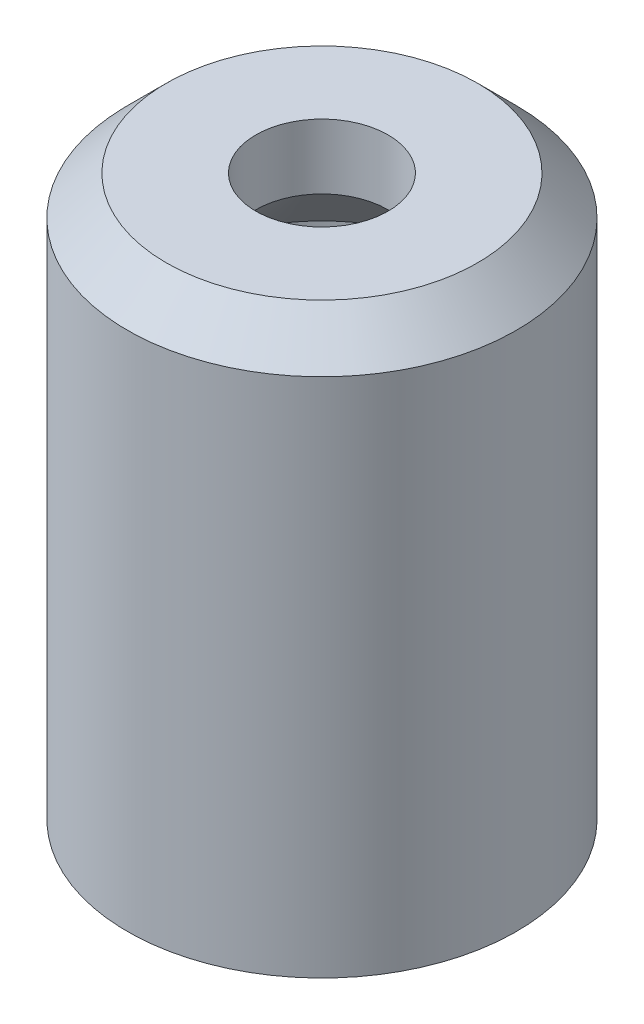
ISO-10303-21;
HEADER;
FILE_DESCRIPTION(('STEP AP214'),'2;1');
FILE_NAME('part.step','',(''),(''),'','','');
FILE_SCHEMA(('AUTOMOTIVE_DESIGN { 1 0 10303 214 1 1 1 1 }'));
ENDSEC;
DATA;
#1=APPLICATION_CONTEXT('core data for automotive mechanical design processes');
#2=APPLICATION_PROTOCOL_DEFINITION('international standard','automotive_design',2000,#1);
#3=PRODUCT_CONTEXT('',#1,'mechanical');
#4=PRODUCT('Part','Part','',(#3));
#5=PRODUCT_RELATED_PRODUCT_CATEGORY('part','',(#4));
#6=PRODUCT_DEFINITION_FORMATION('','',#4);
#7=PRODUCT_DEFINITION_CONTEXT('part definition',#1,'design');
#8=PRODUCT_DEFINITION('design','',#6,#7);
#9=PRODUCT_DEFINITION_SHAPE('','',#8);
#10=(LENGTH_UNIT() NAMED_UNIT(*) SI_UNIT(.MILLI.,.METRE.));
#11=(NAMED_UNIT(*) PLANE_ANGLE_UNIT() SI_UNIT($,.RADIAN.));
#12=(NAMED_UNIT(*) SI_UNIT($,.STERADIAN.) SOLID_ANGLE_UNIT());
#13=UNCERTAINTY_MEASURE_WITH_UNIT(LENGTH_MEASURE(1.E-05),#10,'distance_accuracy_value','');
#14=(GEOMETRIC_REPRESENTATION_CONTEXT(3) GLOBAL_UNCERTAINTY_ASSIGNED_CONTEXT((#13)) GLOBAL_UNIT_ASSIGNED_CONTEXT((#10,
#11,#12)) REPRESENTATION_CONTEXT('',''));
#15=CARTESIAN_POINT('',(0.,0.,0.));
#16=DIRECTION('',(0.,0.,1.));
#17=DIRECTION('',(1.,0.,0.));
#18=AXIS2_PLACEMENT_3D('',#15,#16,#17);
#19=CARTESIAN_POINT('',(-15.,-2.,0.));
#20=DIRECTION('',(0.,1.,0.));
#21=DIRECTION('',(0.,0.,1.));
#22=AXIS2_PLACEMENT_3D('',#19,#20,#21);
#23=PLANE('',#22);
#24=CARTESIAN_POINT('',(0.,-2.,0.));
#25=DIRECTION('',(0.,-1.,0.));
#26=DIRECTION('',(0.,0.,-1.));
#27=AXIS2_PLACEMENT_3D('',#24,#25,#26);
#28=CIRCLE('',#27,11.25);
#29=CARTESIAN_POINT('',(0.,-2.,-11.25));
#30=VERTEX_POINT('',#29);
#31=EDGE_CURVE('E10',#30,#30,#28,.T.);
#32=ORIENTED_EDGE('',*,*,#31,.F.);
#33=EDGE_LOOP('',(#32));
#34=FACE_BOUND('',#33,.T.);
#35=CARTESIAN_POINT('',(0.,-2.,0.));
#36=DIRECTION('',(0.,-1.,0.));
#37=DIRECTION('',(0.,0.,-1.));
#38=AXIS2_PLACEMENT_3D('',#35,#36,#37);
#39=CIRCLE('',#38,15.);
#40=CARTESIAN_POINT('',(0.,-2.,-15.));
#41=VERTEX_POINT('',#40);
#42=EDGE_CURVE('E68',#41,#41,#39,.T.);
#43=ORIENTED_EDGE('',*,*,#42,.T.);
#44=EDGE_LOOP('',(#43));
#45=FACE_BOUND('',#44,.T.);
#46=ADVANCED_FACE('F37',(#34,#45),#23,.F.);
#47=CARTESIAN_POINT('',(0.,0.,0.));
#48=DIRECTION('',(0.,-1.,0.));
#49=DIRECTION('',(0.,0.,-1.));
#50=AXIS2_PLACEMENT_3D('',#47,#48,#49);
#51=CYLINDRICAL_SURFACE('',#50,11.25);
#52=CARTESIAN_POINT('',(0.,30.,0.));
#53=DIRECTION('',(0.,-1.,0.));
#54=DIRECTION('',(0.,0.,-1.));
#55=AXIS2_PLACEMENT_3D('',#52,#53,#54);
#56=CIRCLE('',#55,11.25);
#57=CARTESIAN_POINT('',(0.,30.,-11.25));
#58=VERTEX_POINT('',#57);
#59=EDGE_CURVE('E44',#58,#58,#56,.T.);
#60=ORIENTED_EDGE('',*,*,#59,.F.);
#61=EDGE_LOOP('',(#60));
#62=FACE_BOUND('',#61,.T.);
#63=ORIENTED_EDGE('',*,*,#31,.T.);
#64=EDGE_LOOP('',(#63));
#65=FACE_BOUND('',#64,.T.);
#66=ADVANCED_FACE('F100',(#62,#65),#51,.F.);
#67=CARTESIAN_POINT('',(0.,30.,0.));
#68=DIRECTION('',(0.,-1.,0.));
#69=DIRECTION('',(0.,0.,-1.));
#70=AXIS2_PLACEMENT_3D('',#67,#68,#69);
#71=CONICAL_SURFACE('',#70,11.25,0.78539816339745);
#72=CARTESIAN_POINT('',(0.,36.15,0.));
#73=DIRECTION('',(0.,-1.,0.));
#74=DIRECTION('',(0.,0.,-1.));
#75=AXIS2_PLACEMENT_3D('',#72,#73,#74);
#76=CIRCLE('',#75,5.1);
#77=CARTESIAN_POINT('',(0.,36.15,-5.1));
#78=VERTEX_POINT('',#77);
#79=EDGE_CURVE('E49',#78,#78,#76,.T.);
#80=ORIENTED_EDGE('',*,*,#79,.F.);
#81=EDGE_LOOP('',(#80));
#82=FACE_BOUND('',#81,.T.);
#83=ORIENTED_EDGE('',*,*,#59,.T.);
#84=EDGE_LOOP('',(#83));
#85=FACE_BOUND('',#84,.T.);
#86=ADVANCED_FACE('F95',(#82,#85),#71,.F.);
#87=CARTESIAN_POINT('',(0.,0.,0.));
#88=DIRECTION('',(0.,-1.,0.));
#89=DIRECTION('',(0.,0.,-1.));
#90=AXIS2_PLACEMENT_3D('',#87,#88,#89);
#91=CYLINDRICAL_SURFACE('',#90,5.1);
#92=CARTESIAN_POINT('',(0.,41.15,0.));
#93=DIRECTION('',(0.,-1.,0.));
#94=DIRECTION('',(0.,0.,-1.));
#95=AXIS2_PLACEMENT_3D('',#92,#93,#94);
#96=CIRCLE('',#95,5.1);
#97=CARTESIAN_POINT('',(0.,41.15,-5.1));
#98=VERTEX_POINT('',#97);
#99=EDGE_CURVE('E54',#98,#98,#96,.T.);
#100=ORIENTED_EDGE('',*,*,#99,.F.);
#101=EDGE_LOOP('',(#100));
#102=FACE_BOUND('',#101,.T.);
#103=ORIENTED_EDGE('',*,*,#79,.T.);
#104=EDGE_LOOP('',(#103));
#105=FACE_BOUND('',#104,.T.);
#106=ADVANCED_FACE('F89',(#102,#105),#91,.F.);
#107=CARTESIAN_POINT('',(-12.,41.15,0.));
#108=DIRECTION('',(0.,-1.,0.));
#109=DIRECTION('',(0.,0.,-1.));
#110=AXIS2_PLACEMENT_3D('',#107,#108,#109);
#111=PLANE('',#110);
#112=CARTESIAN_POINT('',(0.,41.15,0.));
#113=DIRECTION('',(0.,-1.,0.));
#114=DIRECTION('',(0.,0.,-1.));
#115=AXIS2_PLACEMENT_3D('',#112,#113,#114);
#116=CIRCLE('',#115,12.);
#117=CARTESIAN_POINT('',(0.,41.15,-12.));
#118=VERTEX_POINT('',#117);
#119=EDGE_CURVE('E60',#118,#118,#116,.T.);
#120=ORIENTED_EDGE('',*,*,#119,.F.);
#121=EDGE_LOOP('',(#120));
#122=FACE_BOUND('',#121,.T.);
#123=ORIENTED_EDGE('',*,*,#99,.T.);
#124=EDGE_LOOP('',(#123));
#125=FACE_BOUND('',#124,.T.);
#126=ADVANCED_FACE('F83',(#122,#125),#111,.F.);
#127=CARTESIAN_POINT('',(0.,41.15,0.));
#128=DIRECTION('',(0.,-1.,0.));
#129=DIRECTION('',(0.,0.,-1.));
#130=AXIS2_PLACEMENT_3D('',#127,#128,#129);
#131=CONICAL_SURFACE('',#130,12.,0.785398163397451);
#132=CARTESIAN_POINT('',(0.,38.15,0.));
#133=DIRECTION('',(0.,-1.,0.));
#134=DIRECTION('',(0.,0.,-1.));
#135=AXIS2_PLACEMENT_3D('',#132,#133,#134);
#136=CIRCLE('',#135,15.);
#137=CARTESIAN_POINT('',(0.,38.15,-15.));
#138=VERTEX_POINT('',#137);
#139=EDGE_CURVE('E64',#138,#138,#136,.T.);
#140=ORIENTED_EDGE('',*,*,#139,.F.);
#141=EDGE_LOOP('',(#140));
#142=FACE_BOUND('',#141,.T.);
#143=ORIENTED_EDGE('',*,*,#119,.T.);
#144=EDGE_LOOP('',(#143));
#145=FACE_BOUND('',#144,.T.);
#146=ADVANCED_FACE('F77',(#142,#145),#131,.T.);
#147=CARTESIAN_POINT('',(0.,0.,0.));
#148=DIRECTION('',(0.,-1.,0.));
#149=DIRECTION('',(0.,0.,-1.));
#150=AXIS2_PLACEMENT_3D('',#147,#148,#149);
#151=CYLINDRICAL_SURFACE('',#150,15.);
#152=ORIENTED_EDGE('',*,*,#42,.F.);
#153=EDGE_LOOP('',(#152));
#154=FACE_BOUND('',#153,.T.);
#155=ORIENTED_EDGE('',*,*,#139,.T.);
#156=EDGE_LOOP('',(#155));
#157=FACE_BOUND('',#156,.T.);
#158=ADVANCED_FACE('F74',(#154,#157),#151,.T.);
#159=CLOSED_SHELL('',(#46,#66,#86,#106,#126,#146,#158));
#160=MANIFOLD_SOLID_BREP('B2',#159);
#161=ADVANCED_BREP_SHAPE_REPRESENTATION('',(#18,#160),#14);
#162=SHAPE_DEFINITION_REPRESENTATION(#9,#161);
ENDSEC;
END-ISO-10303-21;
